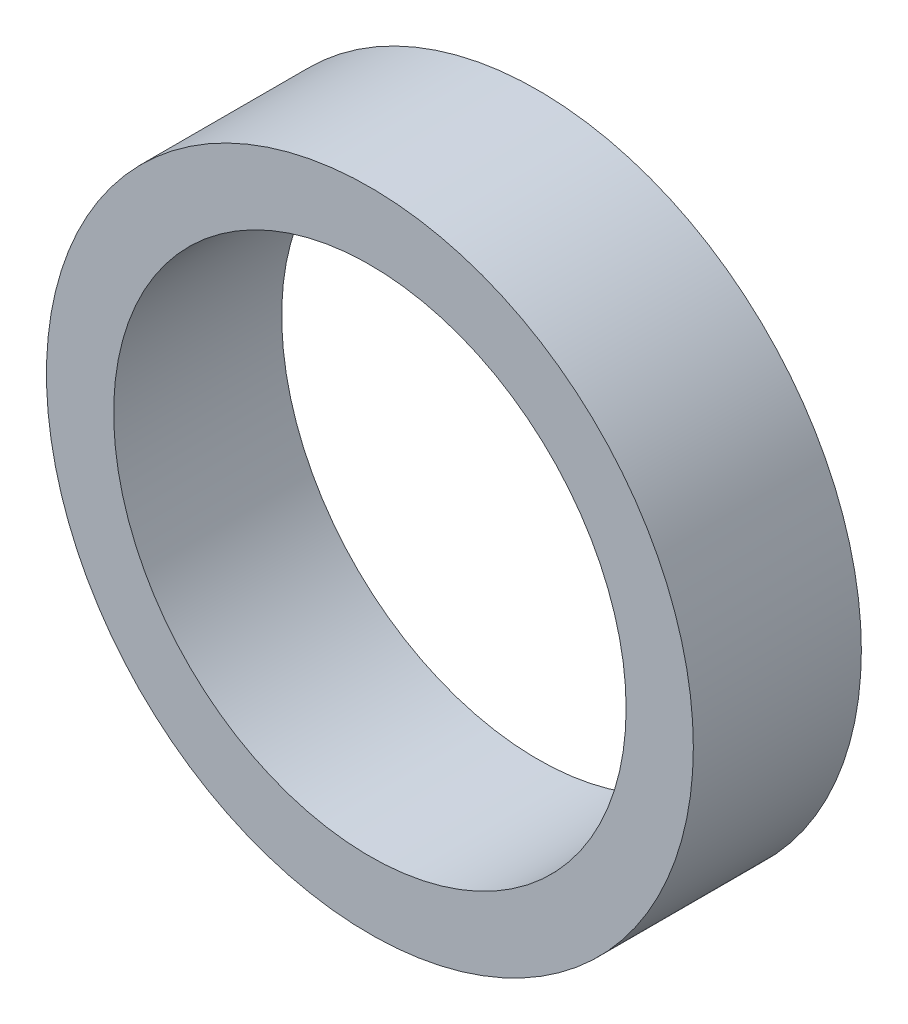
ISO-10303-21;
HEADER;
FILE_DESCRIPTION(('STEP AP214'),'2;1');
FILE_NAME('part.step','',(''),(''),'','','');
FILE_SCHEMA(('AUTOMOTIVE_DESIGN { 1 0 10303 214 1 1 1 1 }'));
ENDSEC;
DATA;
#1=APPLICATION_CONTEXT('core data for automotive mechanical design processes');
#2=APPLICATION_PROTOCOL_DEFINITION('international standard','automotive_design',2000,#1);
#3=PRODUCT_CONTEXT('',#1,'mechanical');
#4=PRODUCT('Part','Part','',(#3));
#5=PRODUCT_RELATED_PRODUCT_CATEGORY('part','',(#4));
#6=PRODUCT_DEFINITION_FORMATION('','',#4);
#7=PRODUCT_DEFINITION_CONTEXT('part definition',#1,'design');
#8=PRODUCT_DEFINITION('design','',#6,#7);
#9=PRODUCT_DEFINITION_SHAPE('','',#8);
#10=(LENGTH_UNIT() NAMED_UNIT(*) SI_UNIT(.MILLI.,.METRE.));
#11=(NAMED_UNIT(*) PLANE_ANGLE_UNIT() SI_UNIT($,.RADIAN.));
#12=(NAMED_UNIT(*) SI_UNIT($,.STERADIAN.) SOLID_ANGLE_UNIT());
#13=UNCERTAINTY_MEASURE_WITH_UNIT(LENGTH_MEASURE(1.E-05),#10,'distance_accuracy_value','');
#14=(GEOMETRIC_REPRESENTATION_CONTEXT(3) GLOBAL_UNCERTAINTY_ASSIGNED_CONTEXT((#13)) GLOBAL_UNIT_ASSIGNED_CONTEXT((#10,
#11,#12)) REPRESENTATION_CONTEXT('',''));
#15=CARTESIAN_POINT('',(0.,0.,0.));
#16=DIRECTION('',(0.,0.,1.));
#17=DIRECTION('',(1.,0.,0.));
#18=AXIS2_PLACEMENT_3D('',#15,#16,#17);
#19=CARTESIAN_POINT('',(0.,0.,1.));
#20=DIRECTION('',(0.,0.,1.));
#21=DIRECTION('',(1.,0.,0.));
#22=AXIS2_PLACEMENT_3D('',#19,#20,#21);
#23=PLANE('',#22);
#24=CARTESIAN_POINT('',(0.,0.,1.));
#25=DIRECTION('',(0.,0.,1.));
#26=DIRECTION('',(1.,0.,0.));
#27=AXIS2_PLACEMENT_3D('',#24,#25,#26);
#28=CIRCLE('',#27,1.925);
#29=CARTESIAN_POINT('',(1.925,0.,1.));
#30=VERTEX_POINT('',#29);
#31=EDGE_CURVE('E10',#30,#30,#28,.T.);
#32=ORIENTED_EDGE('',*,*,#31,.T.);
#33=EDGE_LOOP('',(#32));
#34=FACE_BOUND('',#33,.T.);
#35=CARTESIAN_POINT('',(0.,0.,1.));
#36=DIRECTION('',(0.,0.,1.));
#37=DIRECTION('',(1.,0.,0.));
#38=AXIS2_PLACEMENT_3D('',#35,#36,#37);
#39=CIRCLE('',#38,1.525);
#40=CARTESIAN_POINT('',(1.525,0.,1.));
#41=VERTEX_POINT('',#40);
#42=EDGE_CURVE('E42',#41,#41,#39,.T.);
#43=ORIENTED_EDGE('',*,*,#42,.F.);
#44=EDGE_LOOP('',(#43));
#45=FACE_BOUND('',#44,.T.);
#46=ADVANCED_FACE('F31',(#34,#45),#23,.T.);
#47=CARTESIAN_POINT('',(0.,0.,0.));
#48=DIRECTION('',(0.,0.,1.));
#49=DIRECTION('',(1.,0.,0.));
#50=AXIS2_PLACEMENT_3D('',#47,#48,#49);
#51=PLANE('',#50);
#52=CARTESIAN_POINT('',(0.,0.,0.));
#53=DIRECTION('',(0.,0.,1.));
#54=DIRECTION('',(1.,0.,0.));
#55=AXIS2_PLACEMENT_3D('',#52,#53,#54);
#56=CIRCLE('',#55,1.925);
#57=CARTESIAN_POINT('',(1.925,0.,0.));
#58=VERTEX_POINT('',#57);
#59=EDGE_CURVE('E35',#58,#58,#56,.T.);
#60=ORIENTED_EDGE('',*,*,#59,.F.);
#61=EDGE_LOOP('',(#60));
#62=FACE_BOUND('',#61,.T.);
#63=CARTESIAN_POINT('',(0.,0.,0.));
#64=DIRECTION('',(0.,0.,1.));
#65=DIRECTION('',(1.,0.,0.));
#66=AXIS2_PLACEMENT_3D('',#63,#64,#65);
#67=CIRCLE('',#66,1.525);
#68=CARTESIAN_POINT('',(1.525,0.,0.));
#69=VERTEX_POINT('',#68);
#70=EDGE_CURVE('E44',#69,#69,#67,.T.);
#71=ORIENTED_EDGE('',*,*,#70,.T.);
#72=EDGE_LOOP('',(#71));
#73=FACE_BOUND('',#72,.T.);
#74=ADVANCED_FACE('F54',(#62,#73),#51,.F.);
#75=CARTESIAN_POINT('',(0.,0.,1.));
#76=DIRECTION('',(0.,0.,-1.));
#77=DIRECTION('',(-1.,0.,0.));
#78=AXIS2_PLACEMENT_3D('',#75,#76,#77);
#79=CYLINDRICAL_SURFACE('',#78,1.925);
#80=ORIENTED_EDGE('',*,*,#31,.F.);
#81=EDGE_LOOP('',(#80));
#82=FACE_BOUND('',#81,.T.);
#83=ORIENTED_EDGE('',*,*,#59,.T.);
#84=EDGE_LOOP('',(#83));
#85=FACE_BOUND('',#84,.T.);
#86=ADVANCED_FACE('F33',(#82,#85),#79,.T.);
#87=CARTESIAN_POINT('',(0.,0.,1.));
#88=DIRECTION('',(0.,0.,-1.));
#89=DIRECTION('',(-1.,0.,0.));
#90=AXIS2_PLACEMENT_3D('',#87,#88,#89);
#91=CYLINDRICAL_SURFACE('',#90,1.525);
#92=ORIENTED_EDGE('',*,*,#42,.T.);
#93=EDGE_LOOP('',(#92));
#94=FACE_BOUND('',#93,.T.);
#95=ORIENTED_EDGE('',*,*,#70,.F.);
#96=EDGE_LOOP('',(#95));
#97=FACE_BOUND('',#96,.T.);
#98=ADVANCED_FACE('F50',(#94,#97),#91,.F.);
#99=CLOSED_SHELL('',(#46,#74,#86,#98));
#100=MANIFOLD_SOLID_BREP('B2',#99);
#101=ADVANCED_BREP_SHAPE_REPRESENTATION('',(#18,#100),#14);
#102=SHAPE_DEFINITION_REPRESENTATION(#9,#101);
ENDSEC;
END-ISO-10303-21;
